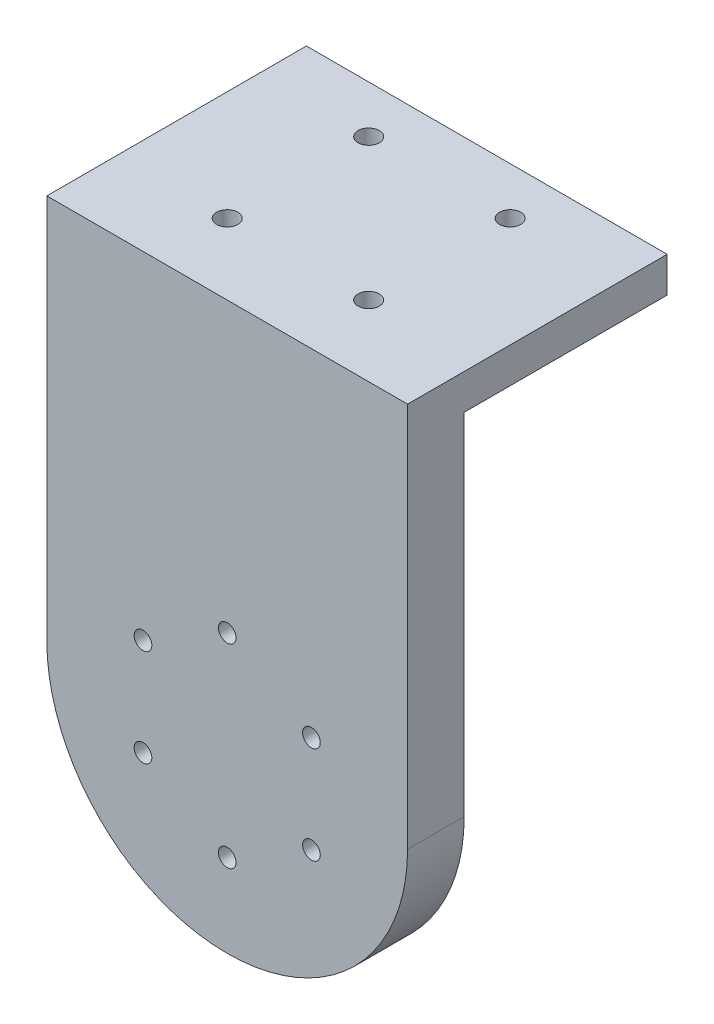
ISO-10303-21;
HEADER;
FILE_DESCRIPTION(('STEP AP214'),'2;1');
FILE_NAME('part.step','',(''),(''),'','','');
FILE_SCHEMA(('AUTOMOTIVE_DESIGN { 1 0 10303 214 1 1 1 1 }'));
ENDSEC;
DATA;
#1=APPLICATION_CONTEXT('core data for automotive mechanical design processes');
#2=APPLICATION_PROTOCOL_DEFINITION('international standard','automotive_design',2000,#1);
#3=PRODUCT_CONTEXT('',#1,'mechanical');
#4=PRODUCT('Part','Part','',(#3));
#5=PRODUCT_RELATED_PRODUCT_CATEGORY('part','',(#4));
#6=PRODUCT_DEFINITION_FORMATION('','',#4);
#7=PRODUCT_DEFINITION_CONTEXT('part definition',#1,'design');
#8=PRODUCT_DEFINITION('design','',#6,#7);
#9=PRODUCT_DEFINITION_SHAPE('','',#8);
#10=(LENGTH_UNIT() NAMED_UNIT(*) SI_UNIT(.MILLI.,.METRE.));
#11=(NAMED_UNIT(*) PLANE_ANGLE_UNIT() SI_UNIT($,.RADIAN.));
#12=(NAMED_UNIT(*) SI_UNIT($,.STERADIAN.) SOLID_ANGLE_UNIT());
#13=UNCERTAINTY_MEASURE_WITH_UNIT(LENGTH_MEASURE(1.E-05),#10,'distance_accuracy_value','');
#14=(GEOMETRIC_REPRESENTATION_CONTEXT(3) GLOBAL_UNCERTAINTY_ASSIGNED_CONTEXT((#13)) GLOBAL_UNIT_ASSIGNED_CONTEXT((#10,
#11,#12)) REPRESENTATION_CONTEXT('',''));
#15=CARTESIAN_POINT('',(0.,0.,0.));
#16=DIRECTION('',(0.,0.,1.));
#17=DIRECTION('',(1.,0.,0.));
#18=AXIS2_PLACEMENT_3D('',#15,#16,#17);
#19=CARTESIAN_POINT('',(25.5,0.,0.));
#20=DIRECTION('',(0.,0.,1.));
#21=DIRECTION('',(1.,0.,0.));
#22=AXIS2_PLACEMENT_3D('',#19,#20,#21);
#23=PLANE('',#22);
#24=CARTESIAN_POINT('',(25.5,0.,0.));
#25=DIRECTION('',(0.,0.,-1.));
#26=DIRECTION('',(-1.,0.,0.));
#27=AXIS2_PLACEMENT_3D('',#24,#25,#26);
#28=CIRCLE('',#27,17.5);
#29=CARTESIAN_POINT('',(7.99999999999999,0.,0.));
#30=VERTEX_POINT('',#29);
#31=EDGE_CURVE('E154',#30,#30,#28,.T.);
#32=ORIENTED_EDGE('',*,*,#31,.F.);
#33=EDGE_LOOP('',(#32));
#34=FACE_BOUND('',#33,.T.);
#35=DIRECTION('',(-1.,0.,0.));
#36=VECTOR('',#35,1.);
#37=CARTESIAN_POINT('',(51.,49.5,0.));
#38=LINE('',#37,#36);
#39=CARTESIAN_POINT('',(51.,49.5,0.));
#40=VERTEX_POINT('',#39);
#41=CARTESIAN_POINT('',(0.,49.5,0.));
#42=VERTEX_POINT('',#41);
#43=EDGE_CURVE('E56',#40,#42,#38,.T.);
#44=ORIENTED_EDGE('',*,*,#43,.F.);
#45=DIRECTION('',(0.,1.,0.));
#46=VECTOR('',#45,1.);
#47=CARTESIAN_POINT('',(51.,0.,0.));
#48=LINE('',#47,#46);
#49=CARTESIAN_POINT('',(51.,0.,0.));
#50=VERTEX_POINT('',#49);
#51=EDGE_CURVE('E121',#50,#40,#48,.T.);
#52=ORIENTED_EDGE('',*,*,#51,.F.);
#53=CARTESIAN_POINT('',(25.5,0.,0.));
#54=DIRECTION('',(0.,0.,1.));
#55=DIRECTION('',(1.,0.,0.));
#56=AXIS2_PLACEMENT_3D('',#53,#54,#55);
#57=CIRCLE('',#56,25.5);
#58=CARTESIAN_POINT('',(0.,0.,0.));
#59=VERTEX_POINT('',#58);
#60=EDGE_CURVE('E122',#59,#50,#57,.T.);
#61=ORIENTED_EDGE('',*,*,#60,.F.);
#62=DIRECTION('',(0.,-1.,0.));
#63=VECTOR('',#62,1.);
#64=CARTESIAN_POINT('',(0.,0.,0.));
#65=LINE('',#64,#63);
#66=EDGE_CURVE('E78',#42,#59,#65,.T.);
#67=ORIENTED_EDGE('',*,*,#66,.F.);
#68=EDGE_LOOP('',(#44,#52,#61,#67));
#69=FACE_BOUND('',#68,.T.);
#70=ADVANCED_FACE('F41',(#34,#69),#23,.F.);
#71=CARTESIAN_POINT('',(25.5,0.,8.));
#72=DIRECTION('',(0.,0.,-1.));
#73=DIRECTION('',(-1.,0.,0.));
#74=AXIS2_PLACEMENT_3D('',#71,#72,#73);
#75=CYLINDRICAL_SURFACE('',#74,25.5);
#76=ORIENTED_EDGE('',*,*,#60,.T.);
#77=DIRECTION('',(0.,0.,-1.));
#78=VECTOR('',#77,1.);
#79=CARTESIAN_POINT('',(51.,0.,8.));
#80=LINE('',#79,#78);
#81=CARTESIAN_POINT('',(51.,0.,8.));
#82=VERTEX_POINT('',#81);
#83=EDGE_CURVE('E11',#82,#50,#80,.T.);
#84=ORIENTED_EDGE('',*,*,#83,.F.);
#85=CARTESIAN_POINT('',(25.5,0.,8.));
#86=DIRECTION('',(0.,0.,1.));
#87=DIRECTION('',(1.,0.,0.));
#88=AXIS2_PLACEMENT_3D('',#85,#86,#87);
#89=CIRCLE('',#88,25.5);
#90=CARTESIAN_POINT('',(0.,0.,8.));
#91=VERTEX_POINT('',#90);
#92=EDGE_CURVE('E129',#91,#82,#89,.T.);
#93=ORIENTED_EDGE('',*,*,#92,.F.);
#94=DIRECTION('',(0.,0.,-1.));
#95=VECTOR('',#94,1.);
#96=CARTESIAN_POINT('',(0.,0.,8.));
#97=LINE('',#96,#95);
#98=EDGE_CURVE('E134',#91,#59,#97,.T.);
#99=ORIENTED_EDGE('',*,*,#98,.T.);
#100=EDGE_LOOP('',(#76,#84,#93,#99));
#101=FACE_BOUND('',#100,.T.);
#102=ADVANCED_FACE('F43',(#101),#75,.T.);
#103=CARTESIAN_POINT('',(51.,0.,8.));
#104=DIRECTION('',(-1.,0.,0.));
#105=DIRECTION('',(0.,0.,1.));
#106=AXIS2_PLACEMENT_3D('',#103,#104,#105);
#107=PLANE('',#106);
#108=ORIENTED_EDGE('',*,*,#51,.T.);
#109=DIRECTION('',(0.,0.,1.));
#110=VECTOR('',#109,1.);
#111=CARTESIAN_POINT('',(51.,49.5,-28.7));
#112=LINE('',#111,#110);
#113=CARTESIAN_POINT('',(51.,49.5,-28.7));
#114=VERTEX_POINT('',#113);
#115=EDGE_CURVE('E106',#114,#40,#112,.T.);
#116=ORIENTED_EDGE('',*,*,#115,.F.);
#117=DIRECTION('',(0.,-1.,0.));
#118=VECTOR('',#117,1.);
#119=CARTESIAN_POINT('',(51.,54.5,-28.7));
#120=LINE('',#119,#118);
#121=CARTESIAN_POINT('',(51.,54.5,-28.7));
#122=VERTEX_POINT('',#121);
#123=EDGE_CURVE('E112',#122,#114,#120,.T.);
#124=ORIENTED_EDGE('',*,*,#123,.F.);
#125=DIRECTION('',(0.,0.,-1.));
#126=VECTOR('',#125,1.);
#127=CARTESIAN_POINT('',(51.,54.5,8.));
#128=LINE('',#127,#126);
#129=CARTESIAN_POINT('',(51.,54.5,8.));
#130=VERTEX_POINT('',#129);
#131=EDGE_CURVE('E49',#130,#122,#128,.T.);
#132=ORIENTED_EDGE('',*,*,#131,.F.);
#133=DIRECTION('',(0.,1.,0.));
#134=VECTOR('',#133,1.);
#135=CARTESIAN_POINT('',(51.,0.,8.));
#136=LINE('',#135,#134);
#137=EDGE_CURVE('E85',#82,#130,#136,.T.);
#138=ORIENTED_EDGE('',*,*,#137,.F.);
#139=ORIENTED_EDGE('',*,*,#83,.T.);
#140=EDGE_LOOP('',(#108,#116,#124,#132,#138,#139));
#141=FACE_BOUND('',#140,.T.);
#142=ADVANCED_FACE('F120',(#141),#107,.F.);
#143=CARTESIAN_POINT('',(0.,54.5,8.));
#144=DIRECTION('',(0.,-1.,0.));
#145=DIRECTION('',(0.,0.,-1.));
#146=AXIS2_PLACEMENT_3D('',#143,#144,#145);
#147=PLANE('',#146);
#148=CARTESIAN_POINT('',(15.5,54.5,-2.));
#149=DIRECTION('',(0.,1.,0.));
#150=DIRECTION('',(0.,0.,1.));
#151=AXIS2_PLACEMENT_3D('',#148,#149,#150);
#152=CIRCLE('',#151,1.5);
#153=CARTESIAN_POINT('',(15.5,54.5,-0.500000000000001));
#154=VERTEX_POINT('',#153);
#155=EDGE_CURVE('E205',#154,#154,#152,.T.);
#156=ORIENTED_EDGE('',*,*,#155,.F.);
#157=EDGE_LOOP('',(#156));
#158=FACE_BOUND('',#157,.T.);
#159=CARTESIAN_POINT('',(35.5,54.5,-2.));
#160=DIRECTION('',(0.,1.,0.));
#161=DIRECTION('',(0.,0.,1.));
#162=AXIS2_PLACEMENT_3D('',#159,#160,#161);
#163=CIRCLE('',#162,1.5);
#164=CARTESIAN_POINT('',(35.5,54.5,-0.499999999999996));
#165=VERTEX_POINT('',#164);
#166=EDGE_CURVE('E211',#165,#165,#163,.T.);
#167=ORIENTED_EDGE('',*,*,#166,.F.);
#168=EDGE_LOOP('',(#167));
#169=FACE_BOUND('',#168,.T.);
#170=CARTESIAN_POINT('',(35.5,54.5,-22.));
#171=DIRECTION('',(0.,1.,0.));
#172=DIRECTION('',(0.,0.,1.));
#173=AXIS2_PLACEMENT_3D('',#170,#171,#172);
#174=CIRCLE('',#173,1.5);
#175=CARTESIAN_POINT('',(35.5,54.5,-20.5));
#176=VERTEX_POINT('',#175);
#177=EDGE_CURVE('E199',#176,#176,#174,.T.);
#178=ORIENTED_EDGE('',*,*,#177,.F.);
#179=EDGE_LOOP('',(#178));
#180=FACE_BOUND('',#179,.T.);
#181=CARTESIAN_POINT('',(15.5,54.5,-22.));
#182=DIRECTION('',(0.,1.,0.));
#183=DIRECTION('',(0.,0.,1.));
#184=AXIS2_PLACEMENT_3D('',#181,#182,#183);
#185=CIRCLE('',#184,1.5);
#186=CARTESIAN_POINT('',(15.5,54.5,-20.5));
#187=VERTEX_POINT('',#186);
#188=EDGE_CURVE('E196',#187,#187,#185,.T.);
#189=ORIENTED_EDGE('',*,*,#188,.F.);
#190=EDGE_LOOP('',(#189));
#191=FACE_BOUND('',#190,.T.);
#192=ORIENTED_EDGE('',*,*,#131,.T.);
#193=DIRECTION('',(1.,0.,0.));
#194=VECTOR('',#193,1.);
#195=CARTESIAN_POINT('',(51.,54.5,-28.7));
#196=LINE('',#195,#194);
#197=CARTESIAN_POINT('',(0.,54.5,-28.7));
#198=VERTEX_POINT('',#197);
#199=EDGE_CURVE('E118',#198,#122,#196,.T.);
#200=ORIENTED_EDGE('',*,*,#199,.F.);
#201=DIRECTION('',(0.,0.,-1.));
#202=VECTOR('',#201,1.);
#203=CARTESIAN_POINT('',(0.,54.5,8.));
#204=LINE('',#203,#202);
#205=CARTESIAN_POINT('',(0.,54.5,8.));
#206=VERTEX_POINT('',#205);
#207=EDGE_CURVE('E139',#206,#198,#204,.T.);
#208=ORIENTED_EDGE('',*,*,#207,.F.);
#209=DIRECTION('',(-1.,0.,0.));
#210=VECTOR('',#209,1.);
#211=CARTESIAN_POINT('',(0.,54.5,8.));
#212=LINE('',#211,#210);
#213=EDGE_CURVE('E132',#130,#206,#212,.T.);
#214=ORIENTED_EDGE('',*,*,#213,.F.);
#215=EDGE_LOOP('',(#192,#200,#208,#214));
#216=FACE_BOUND('',#215,.T.);
#217=ADVANCED_FACE('F142',(#158,#169,#180,#191,#216),#147,.F.);
#218=CARTESIAN_POINT('',(0.,0.,8.));
#219=DIRECTION('',(1.,0.,0.));
#220=DIRECTION('',(0.,0.,-1.));
#221=AXIS2_PLACEMENT_3D('',#218,#219,#220);
#222=PLANE('',#221);
#223=ORIENTED_EDGE('',*,*,#207,.T.);
#224=DIRECTION('',(0.,1.,0.));
#225=VECTOR('',#224,1.);
#226=CARTESIAN_POINT('',(0.,54.5,-28.7));
#227=LINE('',#226,#225);
#228=CARTESIAN_POINT('',(0.,49.5,-28.7));
#229=VERTEX_POINT('',#228);
#230=EDGE_CURVE('E111',#229,#198,#227,.T.);
#231=ORIENTED_EDGE('',*,*,#230,.F.);
#232=DIRECTION('',(0.,0.,1.));
#233=VECTOR('',#232,1.);
#234=CARTESIAN_POINT('',(0.,49.5,-28.7));
#235=LINE('',#234,#233);
#236=EDGE_CURVE('E107',#229,#42,#235,.T.);
#237=ORIENTED_EDGE('',*,*,#236,.T.);
#238=ORIENTED_EDGE('',*,*,#66,.T.);
#239=ORIENTED_EDGE('',*,*,#98,.F.);
#240=DIRECTION('',(0.,-1.,0.));
#241=VECTOR('',#240,1.);
#242=CARTESIAN_POINT('',(0.,0.,8.));
#243=LINE('',#242,#241);
#244=EDGE_CURVE('E65',#206,#91,#243,.T.);
#245=ORIENTED_EDGE('',*,*,#244,.F.);
#246=EDGE_LOOP('',(#223,#231,#237,#238,#239,#245));
#247=FACE_BOUND('',#246,.T.);
#248=ADVANCED_FACE('F150',(#247),#222,.F.);
#249=CARTESIAN_POINT('',(25.5,0.,8.));
#250=DIRECTION('',(0.,0.,1.));
#251=DIRECTION('',(1.,0.,0.));
#252=AXIS2_PLACEMENT_3D('',#249,#250,#251);
#253=PLANE('',#252);
#254=CARTESIAN_POINT('',(25.5,13.75,8.));
#255=DIRECTION('',(0.,0.,1.));
#256=DIRECTION('',(1.,0.,0.));
#257=AXIS2_PLACEMENT_3D('',#254,#255,#256);
#258=CIRCLE('',#257,1.25);
#259=CARTESIAN_POINT('',(26.75,13.75,8.));
#260=VERTEX_POINT('',#259);
#261=EDGE_CURVE('E185',#260,#260,#258,.F.);
#262=ORIENTED_EDGE('',*,*,#261,.T.);
#263=EDGE_LOOP('',(#262));
#264=FACE_BOUND('',#263,.T.);
#265=CARTESIAN_POINT('',(37.4078493020358,6.87499999999981,8.));
#266=DIRECTION('',(0.,0.,1.));
#267=DIRECTION('',(1.,0.,0.));
#268=AXIS2_PLACEMENT_3D('',#265,#266,#267);
#269=CIRCLE('',#268,1.25);
#270=CARTESIAN_POINT('',(38.6578493020358,6.87499999999981,8.));
#271=VERTEX_POINT('',#270);
#272=EDGE_CURVE('E164',#271,#271,#269,.F.);
#273=ORIENTED_EDGE('',*,*,#272,.T.);
#274=EDGE_LOOP('',(#273));
#275=FACE_BOUND('',#274,.T.);
#276=CARTESIAN_POINT('',(37.4078493020355,-6.87500000000022,8.));
#277=DIRECTION('',(0.,0.,1.));
#278=DIRECTION('',(1.,0.,0.));
#279=AXIS2_PLACEMENT_3D('',#276,#277,#278);
#280=CIRCLE('',#279,1.25);
#281=CARTESIAN_POINT('',(38.6578493020355,-6.87500000000022,8.));
#282=VERTEX_POINT('',#281);
#283=EDGE_CURVE('E163',#282,#282,#280,.F.);
#284=ORIENTED_EDGE('',*,*,#283,.T.);
#285=EDGE_LOOP('',(#284));
#286=FACE_BOUND('',#285,.T.);
#287=CARTESIAN_POINT('',(25.4999999999993,-13.75,8.));
#288=DIRECTION('',(0.,0.,1.));
#289=DIRECTION('',(1.,0.,0.));
#290=AXIS2_PLACEMENT_3D('',#287,#288,#289);
#291=CIRCLE('',#290,1.25);
#292=CARTESIAN_POINT('',(26.7499999999993,-13.75,8.));
#293=VERTEX_POINT('',#292);
#294=EDGE_CURVE('E170',#293,#293,#291,.F.);
#295=ORIENTED_EDGE('',*,*,#294,.T.);
#296=EDGE_LOOP('',(#295));
#297=FACE_BOUND('',#296,.T.);
#298=CARTESIAN_POINT('',(13.5921506979634,-6.87499999999972,8.));
#299=DIRECTION('',(0.,0.,1.));
#300=DIRECTION('',(1.,0.,0.));
#301=AXIS2_PLACEMENT_3D('',#298,#299,#300);
#302=CIRCLE('',#301,1.25);
#303=CARTESIAN_POINT('',(14.8421506979634,-6.87499999999972,8.));
#304=VERTEX_POINT('',#303);
#305=EDGE_CURVE('E176',#304,#304,#302,.F.);
#306=ORIENTED_EDGE('',*,*,#305,.T.);
#307=EDGE_LOOP('',(#306));
#308=FACE_BOUND('',#307,.T.);
#309=CARTESIAN_POINT('',(13.5921506979638,6.8750000000003,8.));
#310=DIRECTION('',(0.,0.,1.));
#311=DIRECTION('',(1.,0.,0.));
#312=AXIS2_PLACEMENT_3D('',#309,#310,#311);
#313=CIRCLE('',#312,1.25);
#314=CARTESIAN_POINT('',(14.8421506979638,6.8750000000003,8.));
#315=VERTEX_POINT('',#314);
#316=EDGE_CURVE('E182',#315,#315,#313,.F.);
#317=ORIENTED_EDGE('',*,*,#316,.T.);
#318=EDGE_LOOP('',(#317));
#319=FACE_BOUND('',#318,.T.);
#320=ORIENTED_EDGE('',*,*,#92,.T.);
#321=ORIENTED_EDGE('',*,*,#137,.T.);
#322=ORIENTED_EDGE('',*,*,#213,.T.);
#323=ORIENTED_EDGE('',*,*,#244,.T.);
#324=EDGE_LOOP('',(#320,#321,#322,#323));
#325=FACE_BOUND('',#324,.T.);
#326=ADVANCED_FACE('F144',(#264,#275,#286,#297,#308,#319,#325),#253,.T.);
#327=CARTESIAN_POINT('',(51.,49.5,-28.7));
#328=DIRECTION('',(0.,1.,0.));
#329=DIRECTION('',(0.,0.,1.));
#330=AXIS2_PLACEMENT_3D('',#327,#328,#329);
#331=PLANE('',#330);
#332=CARTESIAN_POINT('',(15.5,49.5,-2.));
#333=DIRECTION('',(0.,1.,0.));
#334=DIRECTION('',(0.,0.,1.));
#335=AXIS2_PLACEMENT_3D('',#332,#333,#334);
#336=CIRCLE('',#335,1.5);
#337=CARTESIAN_POINT('',(15.5,49.5,-0.500000000000001));
#338=VERTEX_POINT('',#337);
#339=EDGE_CURVE('E202',#338,#338,#336,.T.);
#340=ORIENTED_EDGE('',*,*,#339,.T.);
#341=EDGE_LOOP('',(#340));
#342=FACE_BOUND('',#341,.T.);
#343=CARTESIAN_POINT('',(35.5,49.5,-2.));
#344=DIRECTION('',(0.,1.,0.));
#345=DIRECTION('',(0.,0.,1.));
#346=AXIS2_PLACEMENT_3D('',#343,#344,#345);
#347=CIRCLE('',#346,1.5);
#348=CARTESIAN_POINT('',(35.5,49.5,-0.499999999999996));
#349=VERTEX_POINT('',#348);
#350=EDGE_CURVE('E208',#349,#349,#347,.T.);
#351=ORIENTED_EDGE('',*,*,#350,.T.);
#352=EDGE_LOOP('',(#351));
#353=FACE_BOUND('',#352,.T.);
#354=CARTESIAN_POINT('',(35.5,49.5,-22.));
#355=DIRECTION('',(0.,1.,0.));
#356=DIRECTION('',(0.,0.,1.));
#357=AXIS2_PLACEMENT_3D('',#354,#355,#356);
#358=CIRCLE('',#357,1.5);
#359=CARTESIAN_POINT('',(35.5,49.5,-20.5));
#360=VERTEX_POINT('',#359);
#361=EDGE_CURVE('E214',#360,#360,#358,.T.);
#362=ORIENTED_EDGE('',*,*,#361,.T.);
#363=EDGE_LOOP('',(#362));
#364=FACE_BOUND('',#363,.T.);
#365=CARTESIAN_POINT('',(15.5,49.5,-22.));
#366=DIRECTION('',(0.,1.,0.));
#367=DIRECTION('',(0.,0.,1.));
#368=AXIS2_PLACEMENT_3D('',#365,#366,#367);
#369=CIRCLE('',#368,1.5);
#370=CARTESIAN_POINT('',(15.5,49.5,-20.5));
#371=VERTEX_POINT('',#370);
#372=EDGE_CURVE('E189',#371,#371,#369,.T.);
#373=ORIENTED_EDGE('',*,*,#372,.T.);
#374=EDGE_LOOP('',(#373));
#375=FACE_BOUND('',#374,.T.);
#376=ORIENTED_EDGE('',*,*,#43,.T.);
#377=ORIENTED_EDGE('',*,*,#236,.F.);
#378=DIRECTION('',(-1.,0.,0.));
#379=VECTOR('',#378,1.);
#380=CARTESIAN_POINT('',(51.,49.5,-28.7));
#381=LINE('',#380,#379);
#382=EDGE_CURVE('E102',#114,#229,#381,.T.);
#383=ORIENTED_EDGE('',*,*,#382,.F.);
#384=ORIENTED_EDGE('',*,*,#115,.T.);
#385=EDGE_LOOP('',(#376,#377,#383,#384));
#386=FACE_BOUND('',#385,.T.);
#387=ADVANCED_FACE('F104',(#342,#353,#364,#375,#386),#331,.F.);
#388=CARTESIAN_POINT('',(0.,0.,-28.7));
#389=DIRECTION('',(0.,0.,-1.));
#390=DIRECTION('',(-1.,0.,0.));
#391=AXIS2_PLACEMENT_3D('',#388,#389,#390);
#392=PLANE('',#391);
#393=ORIENTED_EDGE('',*,*,#123,.T.);
#394=ORIENTED_EDGE('',*,*,#382,.T.);
#395=ORIENTED_EDGE('',*,*,#230,.T.);
#396=ORIENTED_EDGE('',*,*,#199,.T.);
#397=EDGE_LOOP('',(#393,#394,#395,#396));
#398=FACE_BOUND('',#397,.T.);
#399=ADVANCED_FACE('F116',(#398),#392,.T.);
#400=CARTESIAN_POINT('',(25.5,0.,2.));
#401=DIRECTION('',(0.,0.,-1.));
#402=DIRECTION('',(-1.,0.,0.));
#403=AXIS2_PLACEMENT_3D('',#400,#401,#402);
#404=CYLINDRICAL_SURFACE('',#403,17.5);
#405=CARTESIAN_POINT('',(25.5,0.,2.));
#406=DIRECTION('',(0.,0.,-1.));
#407=DIRECTION('',(-1.,0.,0.));
#408=AXIS2_PLACEMENT_3D('',#405,#406,#407);
#409=CIRCLE('',#408,17.5);
#410=CARTESIAN_POINT('',(7.99999999999999,0.,2.));
#411=VERTEX_POINT('',#410);
#412=EDGE_CURVE('E149',#411,#411,#409,.T.);
#413=ORIENTED_EDGE('',*,*,#412,.F.);
#414=EDGE_LOOP('',(#413));
#415=FACE_BOUND('',#414,.T.);
#416=ORIENTED_EDGE('',*,*,#31,.T.);
#417=EDGE_LOOP('',(#416));
#418=FACE_BOUND('',#417,.T.);
#419=ADVANCED_FACE('F277',(#415,#418),#404,.F.);
#420=CARTESIAN_POINT('',(25.5,0.,2.));
#421=DIRECTION('',(0.,0.,-1.));
#422=DIRECTION('',(-1.,0.,0.));
#423=AXIS2_PLACEMENT_3D('',#420,#421,#422);
#424=PLANE('',#423);
#425=CARTESIAN_POINT('',(25.5,13.75,2.));
#426=DIRECTION('',(0.,0.,-1.));
#427=DIRECTION('',(-1.,0.,0.));
#428=AXIS2_PLACEMENT_3D('',#425,#426,#427);
#429=CIRCLE('',#428,1.25);
#430=CARTESIAN_POINT('',(24.25,13.75,2.));
#431=VERTEX_POINT('',#430);
#432=EDGE_CURVE('E157',#431,#431,#429,.T.);
#433=ORIENTED_EDGE('',*,*,#432,.F.);
#434=EDGE_LOOP('',(#433));
#435=FACE_BOUND('',#434,.T.);
#436=CARTESIAN_POINT('',(37.4078493020358,6.87499999999981,2.));
#437=DIRECTION('',(0.,0.,-1.));
#438=DIRECTION('',(-1.,0.,0.));
#439=AXIS2_PLACEMENT_3D('',#436,#437,#438);
#440=CIRCLE('',#439,1.25);
#441=CARTESIAN_POINT('',(36.1578493020358,6.87499999999981,2.));
#442=VERTEX_POINT('',#441);
#443=EDGE_CURVE('E186',#442,#442,#440,.T.);
#444=ORIENTED_EDGE('',*,*,#443,.F.);
#445=EDGE_LOOP('',(#444));
#446=FACE_BOUND('',#445,.T.);
#447=CARTESIAN_POINT('',(37.4078493020355,-6.87500000000022,2.));
#448=DIRECTION('',(0.,0.,-1.));
#449=DIRECTION('',(-1.,0.,0.));
#450=AXIS2_PLACEMENT_3D('',#447,#448,#449);
#451=CIRCLE('',#450,1.25);
#452=CARTESIAN_POINT('',(36.1578493020355,-6.87500000000022,2.));
#453=VERTEX_POINT('',#452);
#454=EDGE_CURVE('E160',#453,#453,#451,.T.);
#455=ORIENTED_EDGE('',*,*,#454,.F.);
#456=EDGE_LOOP('',(#455));
#457=FACE_BOUND('',#456,.T.);
#458=CARTESIAN_POINT('',(25.4999999999993,-13.75,2.));
#459=DIRECTION('',(0.,0.,-1.));
#460=DIRECTION('',(-1.,0.,0.));
#461=AXIS2_PLACEMENT_3D('',#458,#459,#460);
#462=CIRCLE('',#461,1.25);
#463=CARTESIAN_POINT('',(24.2499999999993,-13.75,2.));
#464=VERTEX_POINT('',#463);
#465=EDGE_CURVE('E167',#464,#464,#462,.T.);
#466=ORIENTED_EDGE('',*,*,#465,.F.);
#467=EDGE_LOOP('',(#466));
#468=FACE_BOUND('',#467,.T.);
#469=CARTESIAN_POINT('',(13.5921506979634,-6.87499999999972,2.));
#470=DIRECTION('',(0.,0.,-1.));
#471=DIRECTION('',(-1.,0.,0.));
#472=AXIS2_PLACEMENT_3D('',#469,#470,#471);
#473=CIRCLE('',#472,1.25);
#474=CARTESIAN_POINT('',(12.3421506979634,-6.87499999999972,2.));
#475=VERTEX_POINT('',#474);
#476=EDGE_CURVE('E173',#475,#475,#473,.T.);
#477=ORIENTED_EDGE('',*,*,#476,.F.);
#478=EDGE_LOOP('',(#477));
#479=FACE_BOUND('',#478,.T.);
#480=CARTESIAN_POINT('',(13.5921506979638,6.8750000000003,2.));
#481=DIRECTION('',(0.,0.,-1.));
#482=DIRECTION('',(-1.,0.,0.));
#483=AXIS2_PLACEMENT_3D('',#480,#481,#482);
#484=CIRCLE('',#483,1.25);
#485=CARTESIAN_POINT('',(12.3421506979638,6.8750000000003,2.));
#486=VERTEX_POINT('',#485);
#487=EDGE_CURVE('E179',#486,#486,#484,.T.);
#488=ORIENTED_EDGE('',*,*,#487,.F.);
#489=EDGE_LOOP('',(#488));
#490=FACE_BOUND('',#489,.T.);
#491=ORIENTED_EDGE('',*,*,#412,.T.);
#492=EDGE_LOOP('',(#491));
#493=FACE_BOUND('',#492,.T.);
#494=ADVANCED_FACE('F291',(#435,#446,#457,#468,#479,#490,#493),#424,.T.);
#495=CARTESIAN_POINT('',(13.5921506979638,6.8750000000003,8.001));
#496=DIRECTION('',(0.,0.,-1.));
#497=DIRECTION('',(-1.,0.,0.));
#498=AXIS2_PLACEMENT_3D('',#495,#496,#497);
#499=CYLINDRICAL_SURFACE('',#498,1.25);
#500=ORIENTED_EDGE('',*,*,#316,.F.);
#501=EDGE_LOOP('',(#500));
#502=FACE_BOUND('',#501,.T.);
#503=ORIENTED_EDGE('',*,*,#487,.T.);
#504=EDGE_LOOP('',(#503));
#505=FACE_BOUND('',#504,.T.);
#506=ADVANCED_FACE('F302',(#502,#505),#499,.F.);
#507=CARTESIAN_POINT('',(13.5921506979634,-6.87499999999972,8.001));
#508=DIRECTION('',(0.,0.,-1.));
#509=DIRECTION('',(-1.,0.,0.));
#510=AXIS2_PLACEMENT_3D('',#507,#508,#509);
#511=CYLINDRICAL_SURFACE('',#510,1.25);
#512=ORIENTED_EDGE('',*,*,#305,.F.);
#513=EDGE_LOOP('',(#512));
#514=FACE_BOUND('',#513,.T.);
#515=ORIENTED_EDGE('',*,*,#476,.T.);
#516=EDGE_LOOP('',(#515));
#517=FACE_BOUND('',#516,.T.);
#518=ADVANCED_FACE('F312',(#514,#517),#511,.F.);
#519=CARTESIAN_POINT('',(25.4999999999993,-13.75,8.001));
#520=DIRECTION('',(0.,0.,-1.));
#521=DIRECTION('',(-1.,0.,0.));
#522=AXIS2_PLACEMENT_3D('',#519,#520,#521);
#523=CYLINDRICAL_SURFACE('',#522,1.25);
#524=ORIENTED_EDGE('',*,*,#294,.F.);
#525=EDGE_LOOP('',(#524));
#526=FACE_BOUND('',#525,.T.);
#527=ORIENTED_EDGE('',*,*,#465,.T.);
#528=EDGE_LOOP('',(#527));
#529=FACE_BOUND('',#528,.T.);
#530=ADVANCED_FACE('F322',(#526,#529),#523,.F.);
#531=CARTESIAN_POINT('',(37.4078493020355,-6.87500000000022,8.001));
#532=DIRECTION('',(0.,0.,-1.));
#533=DIRECTION('',(-1.,0.,0.));
#534=AXIS2_PLACEMENT_3D('',#531,#532,#533);
#535=CYLINDRICAL_SURFACE('',#534,1.25);
#536=ORIENTED_EDGE('',*,*,#283,.F.);
#537=EDGE_LOOP('',(#536));
#538=FACE_BOUND('',#537,.T.);
#539=ORIENTED_EDGE('',*,*,#454,.T.);
#540=EDGE_LOOP('',(#539));
#541=FACE_BOUND('',#540,.T.);
#542=ADVANCED_FACE('F332',(#538,#541),#535,.F.);
#543=CARTESIAN_POINT('',(37.4078493020358,6.87499999999981,8.001));
#544=DIRECTION('',(0.,0.,-1.));
#545=DIRECTION('',(-1.,0.,0.));
#546=AXIS2_PLACEMENT_3D('',#543,#544,#545);
#547=CYLINDRICAL_SURFACE('',#546,1.25);
#548=ORIENTED_EDGE('',*,*,#272,.F.);
#549=EDGE_LOOP('',(#548));
#550=FACE_BOUND('',#549,.T.);
#551=ORIENTED_EDGE('',*,*,#443,.T.);
#552=EDGE_LOOP('',(#551));
#553=FACE_BOUND('',#552,.T.);
#554=ADVANCED_FACE('F241',(#550,#553),#547,.F.);
#555=CARTESIAN_POINT('',(25.5,13.75,8.001));
#556=DIRECTION('',(0.,0.,-1.));
#557=DIRECTION('',(-1.,0.,0.));
#558=AXIS2_PLACEMENT_3D('',#555,#556,#557);
#559=CYLINDRICAL_SURFACE('',#558,1.25);
#560=ORIENTED_EDGE('',*,*,#261,.F.);
#561=EDGE_LOOP('',(#560));
#562=FACE_BOUND('',#561,.T.);
#563=ORIENTED_EDGE('',*,*,#432,.T.);
#564=EDGE_LOOP('',(#563));
#565=FACE_BOUND('',#564,.T.);
#566=ADVANCED_FACE('F230',(#562,#565),#559,.F.);
#567=CARTESIAN_POINT('',(15.5,49.5,-22.));
#568=DIRECTION('',(0.,1.,0.));
#569=DIRECTION('',(0.,0.,1.));
#570=AXIS2_PLACEMENT_3D('',#567,#568,#569);
#571=CYLINDRICAL_SURFACE('',#570,1.5);
#572=ORIENTED_EDGE('',*,*,#372,.F.);
#573=EDGE_LOOP('',(#572));
#574=FACE_BOUND('',#573,.T.);
#575=ORIENTED_EDGE('',*,*,#188,.T.);
#576=EDGE_LOOP('',(#575));
#577=FACE_BOUND('',#576,.T.);
#578=ADVANCED_FACE('F228',(#574,#577),#571,.F.);
#579=CARTESIAN_POINT('',(35.5,49.5,-22.));
#580=DIRECTION('',(0.,1.,0.));
#581=DIRECTION('',(0.,0.,1.));
#582=AXIS2_PLACEMENT_3D('',#579,#580,#581);
#583=CYLINDRICAL_SURFACE('',#582,1.5);
#584=ORIENTED_EDGE('',*,*,#361,.F.);
#585=EDGE_LOOP('',(#584));
#586=FACE_BOUND('',#585,.T.);
#587=ORIENTED_EDGE('',*,*,#177,.T.);
#588=EDGE_LOOP('',(#587));
#589=FACE_BOUND('',#588,.T.);
#590=ADVANCED_FACE('F220',(#586,#589),#583,.F.);
#591=CARTESIAN_POINT('',(35.5,49.5,-2.));
#592=DIRECTION('',(0.,1.,0.));
#593=DIRECTION('',(0.,0.,1.));
#594=AXIS2_PLACEMENT_3D('',#591,#592,#593);
#595=CYLINDRICAL_SURFACE('',#594,1.5);
#596=ORIENTED_EDGE('',*,*,#350,.F.);
#597=EDGE_LOOP('',(#596));
#598=FACE_BOUND('',#597,.T.);
#599=ORIENTED_EDGE('',*,*,#166,.T.);
#600=EDGE_LOOP('',(#599));
#601=FACE_BOUND('',#600,.T.);
#602=ADVANCED_FACE('F237',(#598,#601),#595,.F.);
#603=CARTESIAN_POINT('',(15.5,49.5,-2.));
#604=DIRECTION('',(0.,1.,0.));
#605=DIRECTION('',(0.,0.,1.));
#606=AXIS2_PLACEMENT_3D('',#603,#604,#605);
#607=CYLINDRICAL_SURFACE('',#606,1.5);
#608=ORIENTED_EDGE('',*,*,#339,.F.);
#609=EDGE_LOOP('',(#608));
#610=FACE_BOUND('',#609,.T.);
#611=ORIENTED_EDGE('',*,*,#155,.T.);
#612=EDGE_LOOP('',(#611));
#613=FACE_BOUND('',#612,.T.);
#614=ADVANCED_FACE('F376',(#610,#613),#607,.F.);
#615=CLOSED_SHELL('',(#70,#102,#142,#217,#248,#326,#387,#399,#419,#494,#506,#518,#530,#542,#554,
#566,#578,#590,#602,#614));
#616=MANIFOLD_SOLID_BREP('B2',#615);
#617=ADVANCED_BREP_SHAPE_REPRESENTATION('',(#18,#616),#14);
#618=SHAPE_DEFINITION_REPRESENTATION(#9,#617);
ENDSEC;
END-ISO-10303-21;
